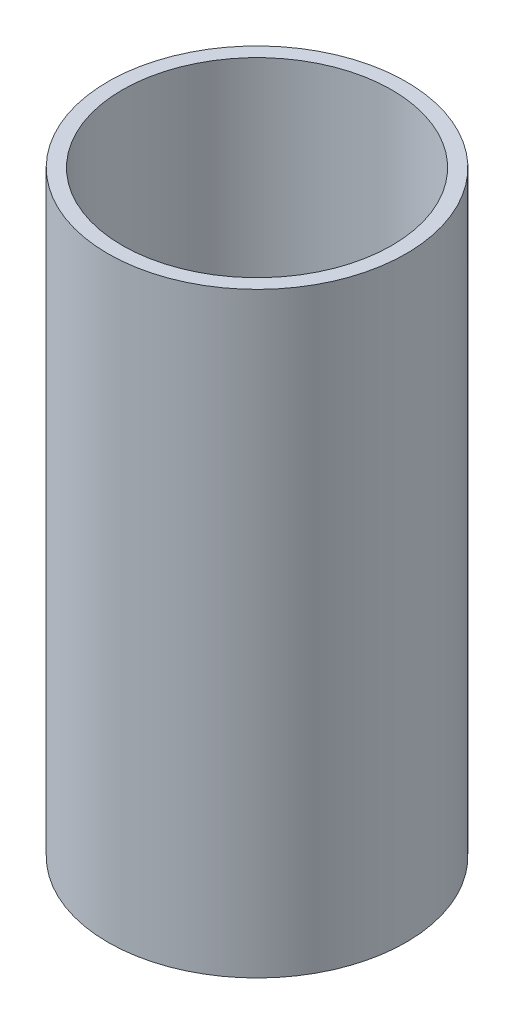
ISO-10303-21;
HEADER;
FILE_DESCRIPTION(('STEP AP214'),'2;1');
FILE_NAME('part.step','',(''),(''),'','','');
FILE_SCHEMA(('AUTOMOTIVE_DESIGN { 1 0 10303 214 1 1 1 1 }'));
ENDSEC;
DATA;
#1=APPLICATION_CONTEXT('core data for automotive mechanical design processes');
#2=APPLICATION_PROTOCOL_DEFINITION('international standard','automotive_design',2000,#1);
#3=PRODUCT_CONTEXT('',#1,'mechanical');
#4=PRODUCT('Part','Part','',(#3));
#5=PRODUCT_RELATED_PRODUCT_CATEGORY('part','',(#4));
#6=PRODUCT_DEFINITION_FORMATION('','',#4);
#7=PRODUCT_DEFINITION_CONTEXT('part definition',#1,'design');
#8=PRODUCT_DEFINITION('design','',#6,#7);
#9=PRODUCT_DEFINITION_SHAPE('','',#8);
#10=(LENGTH_UNIT() NAMED_UNIT(*) SI_UNIT(.MILLI.,.METRE.));
#11=(NAMED_UNIT(*) PLANE_ANGLE_UNIT() SI_UNIT($,.RADIAN.));
#12=(NAMED_UNIT(*) SI_UNIT($,.STERADIAN.) SOLID_ANGLE_UNIT());
#13=UNCERTAINTY_MEASURE_WITH_UNIT(LENGTH_MEASURE(1.E-05),#10,'distance_accuracy_value','');
#14=(GEOMETRIC_REPRESENTATION_CONTEXT(3) GLOBAL_UNCERTAINTY_ASSIGNED_CONTEXT((#13)) GLOBAL_UNIT_ASSIGNED_CONTEXT((#10,
#11,#12)) REPRESENTATION_CONTEXT('',''));
#15=CARTESIAN_POINT('',(0.,0.,0.));
#16=DIRECTION('',(0.,0.,1.));
#17=DIRECTION('',(1.,0.,0.));
#18=AXIS2_PLACEMENT_3D('',#15,#16,#17);
#19=CARTESIAN_POINT('',(0.,100.,0.));
#20=DIRECTION('',(0.,1.,0.));
#21=DIRECTION('',(0.,0.,1.));
#22=AXIS2_PLACEMENT_3D('',#19,#20,#21);
#23=PLANE('',#22);
#24=CARTESIAN_POINT('',(0.,100.,0.));
#25=DIRECTION('',(0.,1.,0.));
#26=DIRECTION('',(0.,0.,1.));
#27=AXIS2_PLACEMENT_3D('',#24,#25,#26);
#28=CIRCLE('',#27,25.);
#29=CARTESIAN_POINT('',(0.,100.,25.));
#30=VERTEX_POINT('',#29);
#31=EDGE_CURVE('E10',#30,#30,#28,.T.);
#32=ORIENTED_EDGE('',*,*,#31,.T.);
#33=EDGE_LOOP('',(#32));
#34=FACE_BOUND('',#33,.T.);
#35=CARTESIAN_POINT('',(0.,100.,0.));
#36=DIRECTION('',(0.,1.,0.));
#37=DIRECTION('',(0.,0.,1.));
#38=AXIS2_PLACEMENT_3D('',#35,#36,#37);
#39=CIRCLE('',#38,22.6);
#40=CARTESIAN_POINT('',(0.,100.,22.6));
#41=VERTEX_POINT('',#40);
#42=EDGE_CURVE('E42',#41,#41,#39,.T.);
#43=ORIENTED_EDGE('',*,*,#42,.F.);
#44=EDGE_LOOP('',(#43));
#45=FACE_BOUND('',#44,.T.);
#46=ADVANCED_FACE('F31',(#34,#45),#23,.T.);
#47=CARTESIAN_POINT('',(0.,0.,0.));
#48=DIRECTION('',(0.,1.,0.));
#49=DIRECTION('',(0.,0.,1.));
#50=AXIS2_PLACEMENT_3D('',#47,#48,#49);
#51=PLANE('',#50);
#52=CARTESIAN_POINT('',(0.,0.,0.));
#53=DIRECTION('',(0.,1.,0.));
#54=DIRECTION('',(0.,0.,1.));
#55=AXIS2_PLACEMENT_3D('',#52,#53,#54);
#56=CIRCLE('',#55,25.);
#57=CARTESIAN_POINT('',(0.,0.,25.));
#58=VERTEX_POINT('',#57);
#59=EDGE_CURVE('E35',#58,#58,#56,.T.);
#60=ORIENTED_EDGE('',*,*,#59,.F.);
#61=EDGE_LOOP('',(#60));
#62=FACE_BOUND('',#61,.T.);
#63=CARTESIAN_POINT('',(0.,0.,0.));
#64=DIRECTION('',(0.,1.,0.));
#65=DIRECTION('',(0.,0.,1.));
#66=AXIS2_PLACEMENT_3D('',#63,#64,#65);
#67=CIRCLE('',#66,22.6);
#68=CARTESIAN_POINT('',(0.,0.,22.6));
#69=VERTEX_POINT('',#68);
#70=EDGE_CURVE('E44',#69,#69,#67,.T.);
#71=ORIENTED_EDGE('',*,*,#70,.T.);
#72=EDGE_LOOP('',(#71));
#73=FACE_BOUND('',#72,.T.);
#74=ADVANCED_FACE('F54',(#62,#73),#51,.F.);
#75=CARTESIAN_POINT('',(0.,100.,0.));
#76=DIRECTION('',(0.,-1.,0.));
#77=DIRECTION('',(0.,0.,-1.));
#78=AXIS2_PLACEMENT_3D('',#75,#76,#77);
#79=CYLINDRICAL_SURFACE('',#78,25.);
#80=ORIENTED_EDGE('',*,*,#31,.F.);
#81=EDGE_LOOP('',(#80));
#82=FACE_BOUND('',#81,.T.);
#83=ORIENTED_EDGE('',*,*,#59,.T.);
#84=EDGE_LOOP('',(#83));
#85=FACE_BOUND('',#84,.T.);
#86=ADVANCED_FACE('F33',(#82,#85),#79,.T.);
#87=CARTESIAN_POINT('',(0.,100.,0.));
#88=DIRECTION('',(0.,-1.,0.));
#89=DIRECTION('',(0.,0.,-1.));
#90=AXIS2_PLACEMENT_3D('',#87,#88,#89);
#91=CYLINDRICAL_SURFACE('',#90,22.6);
#92=ORIENTED_EDGE('',*,*,#42,.T.);
#93=EDGE_LOOP('',(#92));
#94=FACE_BOUND('',#93,.T.);
#95=ORIENTED_EDGE('',*,*,#70,.F.);
#96=EDGE_LOOP('',(#95));
#97=FACE_BOUND('',#96,.T.);
#98=ADVANCED_FACE('F50',(#94,#97),#91,.F.);
#99=CLOSED_SHELL('',(#46,#74,#86,#98));
#100=MANIFOLD_SOLID_BREP('B2',#99);
#101=ADVANCED_BREP_SHAPE_REPRESENTATION('',(#18,#100),#14);
#102=SHAPE_DEFINITION_REPRESENTATION(#9,#101);
ENDSEC;
END-ISO-10303-21;
